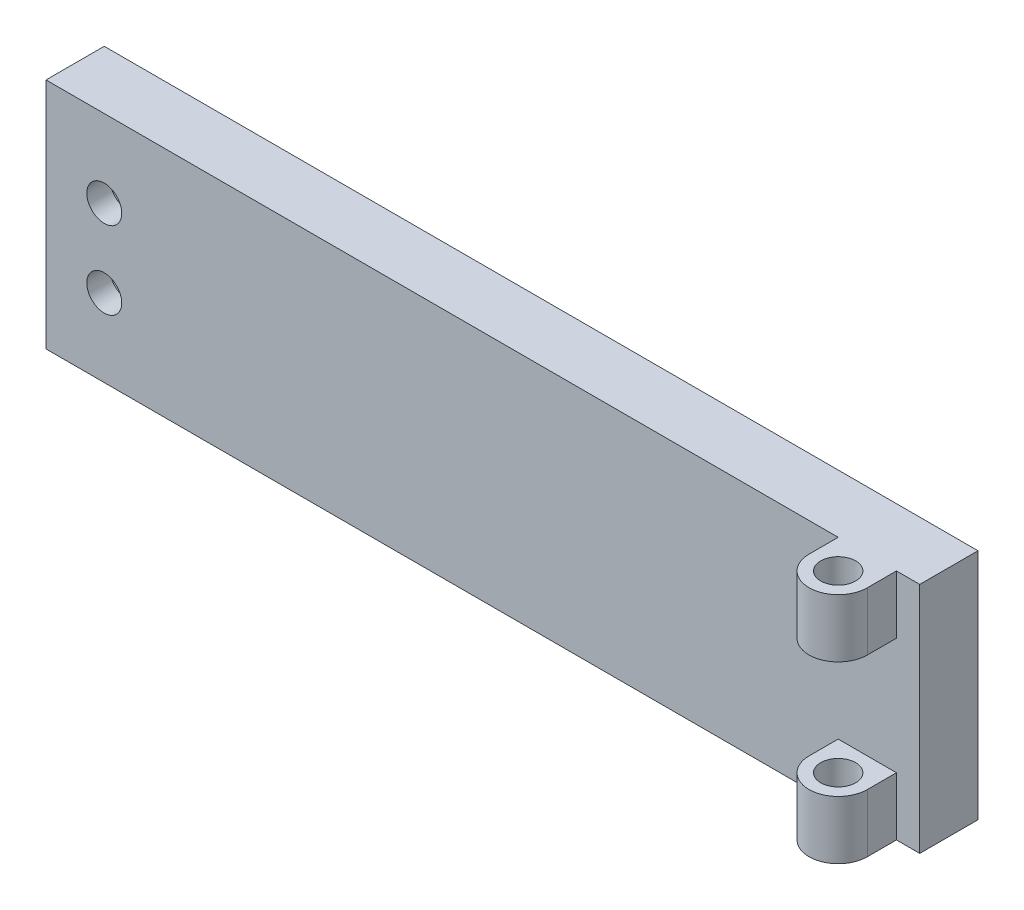
ISO-10303-21;
HEADER;
FILE_DESCRIPTION(('STEP AP214'),'2;1');
FILE_NAME('part.step','',(''),(''),'','','');
FILE_SCHEMA(('AUTOMOTIVE_DESIGN { 1 0 10303 214 1 1 1 1 }'));
ENDSEC;
DATA;
#1=APPLICATION_CONTEXT('core data for automotive mechanical design processes');
#2=APPLICATION_PROTOCOL_DEFINITION('international standard','automotive_design',2000,#1);
#3=PRODUCT_CONTEXT('',#1,'mechanical');
#4=PRODUCT('Part','Part','',(#3));
#5=PRODUCT_RELATED_PRODUCT_CATEGORY('part','',(#4));
#6=PRODUCT_DEFINITION_FORMATION('','',#4);
#7=PRODUCT_DEFINITION_CONTEXT('part definition',#1,'design');
#8=PRODUCT_DEFINITION('design','',#6,#7);
#9=PRODUCT_DEFINITION_SHAPE('','',#8);
#10=(LENGTH_UNIT() NAMED_UNIT(*) SI_UNIT(.MILLI.,.METRE.));
#11=(NAMED_UNIT(*) PLANE_ANGLE_UNIT() SI_UNIT($,.RADIAN.));
#12=(NAMED_UNIT(*) SI_UNIT($,.STERADIAN.) SOLID_ANGLE_UNIT());
#13=UNCERTAINTY_MEASURE_WITH_UNIT(LENGTH_MEASURE(1.E-05),#10,'distance_accuracy_value','');
#14=(GEOMETRIC_REPRESENTATION_CONTEXT(3) GLOBAL_UNCERTAINTY_ASSIGNED_CONTEXT((#13)) GLOBAL_UNIT_ASSIGNED_CONTEXT((#10,
#11,#12)) REPRESENTATION_CONTEXT('',''));
#15=CARTESIAN_POINT('',(0.,0.,0.));
#16=DIRECTION('',(0.,0.,1.));
#17=DIRECTION('',(1.,0.,0.));
#18=AXIS2_PLACEMENT_3D('',#15,#16,#17);
#19=CARTESIAN_POINT('',(5.,13.3333333333333,10.));
#20=DIRECTION('',(0.,0.,-1.));
#21=DIRECTION('',(-1.,0.,0.));
#22=AXIS2_PLACEMENT_3D('',#19,#20,#21);
#23=CYLINDRICAL_SURFACE('',#22,1.5);
#24=CARTESIAN_POINT('',(5.,13.3333333333333,5.));
#25=DIRECTION('',(0.,0.,-1.));
#26=DIRECTION('',(-1.,0.,0.));
#27=AXIS2_PLACEMENT_3D('',#24,#25,#26);
#28=CIRCLE('',#27,1.5);
#29=CARTESIAN_POINT('',(3.5,13.3333333333333,5.));
#30=VERTEX_POINT('',#29);
#31=EDGE_CURVE('E242',#30,#30,#28,.T.);
#32=ORIENTED_EDGE('',*,*,#31,.F.);
#33=EDGE_LOOP('',(#32));
#34=FACE_BOUND('',#33,.T.);
#35=CARTESIAN_POINT('',(5.,13.3333333333333,3.));
#36=DIRECTION('',(0.,0.,-1.));
#37=DIRECTION('',(-1.,0.,0.));
#38=AXIS2_PLACEMENT_3D('',#35,#36,#37);
#39=CIRCLE('',#38,1.5);
#40=CARTESIAN_POINT('',(3.5,13.3333333333333,3.));
#41=VERTEX_POINT('',#40);
#42=EDGE_CURVE('E80',#41,#41,#39,.F.);
#43=ORIENTED_EDGE('',*,*,#42,.F.);
#44=EDGE_LOOP('',(#43));
#45=FACE_BOUND('',#44,.T.);
#46=ADVANCED_FACE('F76',(#34,#45),#23,.F.);
#47=CARTESIAN_POINT('',(5.,6.66666666666667,10.));
#48=DIRECTION('',(0.,0.,-1.));
#49=DIRECTION('',(-1.,0.,0.));
#50=AXIS2_PLACEMENT_3D('',#47,#48,#49);
#51=CYLINDRICAL_SURFACE('',#50,1.5);
#52=CARTESIAN_POINT('',(5.,6.66666666666667,5.));
#53=DIRECTION('',(0.,0.,-1.));
#54=DIRECTION('',(-1.,0.,0.));
#55=AXIS2_PLACEMENT_3D('',#52,#53,#54);
#56=CIRCLE('',#55,1.5);
#57=CARTESIAN_POINT('',(3.5,6.66666666666667,5.));
#58=VERTEX_POINT('',#57);
#59=EDGE_CURVE('E259',#58,#58,#56,.T.);
#60=ORIENTED_EDGE('',*,*,#59,.F.);
#61=EDGE_LOOP('',(#60));
#62=FACE_BOUND('',#61,.T.);
#63=CARTESIAN_POINT('',(5.,6.66666666666667,3.));
#64=DIRECTION('',(0.,0.,-1.));
#65=DIRECTION('',(-1.,0.,0.));
#66=AXIS2_PLACEMENT_3D('',#63,#64,#65);
#67=CIRCLE('',#66,1.5);
#68=CARTESIAN_POINT('',(3.5,6.66666666666667,3.));
#69=VERTEX_POINT('',#68);
#70=EDGE_CURVE('E236',#69,#69,#67,.F.);
#71=ORIENTED_EDGE('',*,*,#70,.F.);
#72=EDGE_LOOP('',(#71));
#73=FACE_BOUND('',#72,.T.);
#74=ADVANCED_FACE('F319',(#62,#73),#51,.F.);
#75=CARTESIAN_POINT('',(0.,0.,5.));
#76=DIRECTION('',(0.,1.,0.));
#77=DIRECTION('',(0.,0.,1.));
#78=AXIS2_PLACEMENT_3D('',#75,#76,#77);
#79=PLANE('',#78);
#80=CARTESIAN_POINT('',(70.5,0.,7.5));
#81=DIRECTION('',(0.,-1.,0.));
#82=DIRECTION('',(0.,0.,-1.));
#83=AXIS2_PLACEMENT_3D('',#80,#81,#82);
#84=CIRCLE('',#83,1.5);
#85=CARTESIAN_POINT('',(70.5,0.,6.));
#86=VERTEX_POINT('',#85);
#87=EDGE_CURVE('E265',#86,#86,#84,.T.);
#88=ORIENTED_EDGE('',*,*,#87,.F.);
#89=EDGE_LOOP('',(#88));
#90=FACE_BOUND('',#89,.T.);
#91=DIRECTION('',(0.,0.,-1.));
#92=VECTOR('',#91,1.);
#93=CARTESIAN_POINT('',(73.,0.,10.));
#94=LINE('',#93,#92);
#95=CARTESIAN_POINT('',(73.,0.,7.5));
#96=VERTEX_POINT('',#95);
#97=CARTESIAN_POINT('',(73.,0.,5.));
#98=VERTEX_POINT('',#97);
#99=EDGE_CURVE('E285',#96,#98,#94,.T.);
#100=ORIENTED_EDGE('',*,*,#99,.F.);
#101=CARTESIAN_POINT('',(70.5,0.,7.5));
#102=DIRECTION('',(0.,-1.,0.));
#103=DIRECTION('',(0.,0.,-1.));
#104=AXIS2_PLACEMENT_3D('',#101,#102,#103);
#105=CIRCLE('',#104,2.5);
#106=CARTESIAN_POINT('',(68.,0.,7.5));
#107=VERTEX_POINT('',#106);
#108=EDGE_CURVE('E181',#107,#96,#105,.F.);
#109=ORIENTED_EDGE('',*,*,#108,.F.);
#110=DIRECTION('',(0.,0.,-1.));
#111=VECTOR('',#110,1.);
#112=CARTESIAN_POINT('',(68.,0.,10.));
#113=LINE('',#112,#111);
#114=CARTESIAN_POINT('',(68.,0.,5.));
#115=VERTEX_POINT('',#114);
#116=EDGE_CURVE('E287',#107,#115,#113,.T.);
#117=ORIENTED_EDGE('',*,*,#116,.T.);
#118=DIRECTION('',(1.,0.,0.));
#119=VECTOR('',#118,1.);
#120=CARTESIAN_POINT('',(0.,0.,5.));
#121=LINE('',#120,#119);
#122=CARTESIAN_POINT('',(0.,0.,5.));
#123=VERTEX_POINT('',#122);
#124=EDGE_CURVE('E210',#123,#115,#121,.T.);
#125=ORIENTED_EDGE('',*,*,#124,.F.);
#126=DIRECTION('',(0.,0.,-1.));
#127=VECTOR('',#126,1.);
#128=CARTESIAN_POINT('',(0.,0.,5.));
#129=LINE('',#128,#127);
#130=CARTESIAN_POINT('',(0.,0.,0.));
#131=VERTEX_POINT('',#130);
#132=EDGE_CURVE('E12',#123,#131,#129,.T.);
#133=ORIENTED_EDGE('',*,*,#132,.T.);
#134=DIRECTION('',(1.,0.,0.));
#135=VECTOR('',#134,1.);
#136=CARTESIAN_POINT('',(0.,0.,0.));
#137=LINE('',#136,#135);
#138=CARTESIAN_POINT('',(75.,0.,0.));
#139=VERTEX_POINT('',#138);
#140=EDGE_CURVE('E221',#131,#139,#137,.T.);
#141=ORIENTED_EDGE('',*,*,#140,.T.);
#142=DIRECTION('',(0.,0.,-1.));
#143=VECTOR('',#142,1.);
#144=CARTESIAN_POINT('',(75.,0.,5.));
#145=LINE('',#144,#143);
#146=CARTESIAN_POINT('',(75.,0.,5.));
#147=VERTEX_POINT('',#146);
#148=EDGE_CURVE('E85',#147,#139,#145,.T.);
#149=ORIENTED_EDGE('',*,*,#148,.F.);
#150=EDGE_CURVE('E208',#98,#147,#121,.T.);
#151=ORIENTED_EDGE('',*,*,#150,.F.);
#152=EDGE_LOOP('',(#100,#109,#117,#125,#133,#141,#149,#151));
#153=FACE_BOUND('',#152,.T.);
#154=ADVANCED_FACE('F325',(#90,#153),#79,.F.);
#155=CARTESIAN_POINT('',(0.,20.,5.));
#156=DIRECTION('',(0.,-1.,0.));
#157=DIRECTION('',(0.,0.,-1.));
#158=AXIS2_PLACEMENT_3D('',#155,#156,#157);
#159=PLANE('',#158);
#160=CARTESIAN_POINT('',(70.5,20.,7.5));
#161=DIRECTION('',(0.,-1.,0.));
#162=DIRECTION('',(0.,0.,-1.));
#163=AXIS2_PLACEMENT_3D('',#160,#161,#162);
#164=CIRCLE('',#163,1.5);
#165=CARTESIAN_POINT('',(70.5,20.,6.));
#166=VERTEX_POINT('',#165);
#167=EDGE_CURVE('E266',#166,#166,#164,.T.);
#168=ORIENTED_EDGE('',*,*,#167,.T.);
#169=EDGE_LOOP('',(#168));
#170=FACE_BOUND('',#169,.T.);
#171=CARTESIAN_POINT('',(70.5,20.,7.5));
#172=DIRECTION('',(0.,-1.,0.));
#173=DIRECTION('',(0.,0.,-1.));
#174=AXIS2_PLACEMENT_3D('',#171,#172,#173);
#175=CIRCLE('',#174,2.5);
#176=CARTESIAN_POINT('',(68.,20.,7.5));
#177=VERTEX_POINT('',#176);
#178=CARTESIAN_POINT('',(73.,20.,7.5));
#179=VERTEX_POINT('',#178);
#180=EDGE_CURVE('E169',#177,#179,#175,.F.);
#181=ORIENTED_EDGE('',*,*,#180,.T.);
#182=DIRECTION('',(0.,0.,-1.));
#183=VECTOR('',#182,1.);
#184=CARTESIAN_POINT('',(73.,20.,10.));
#185=LINE('',#184,#183);
#186=CARTESIAN_POINT('',(73.,20.,5.));
#187=VERTEX_POINT('',#186);
#188=EDGE_CURVE('E174',#179,#187,#185,.T.);
#189=ORIENTED_EDGE('',*,*,#188,.T.);
#190=DIRECTION('',(-1.,0.,0.));
#191=VECTOR('',#190,1.);
#192=CARTESIAN_POINT('',(0.,20.,5.));
#193=LINE('',#192,#191);
#194=CARTESIAN_POINT('',(75.,20.,5.));
#195=VERTEX_POINT('',#194);
#196=EDGE_CURVE('E216',#195,#187,#193,.T.);
#197=ORIENTED_EDGE('',*,*,#196,.F.);
#198=DIRECTION('',(0.,0.,-1.));
#199=VECTOR('',#198,1.);
#200=CARTESIAN_POINT('',(75.,20.,5.));
#201=LINE('',#200,#199);
#202=CARTESIAN_POINT('',(75.,20.,0.));
#203=VERTEX_POINT('',#202);
#204=EDGE_CURVE('E228',#195,#203,#201,.T.);
#205=ORIENTED_EDGE('',*,*,#204,.T.);
#206=DIRECTION('',(-1.,0.,0.));
#207=VECTOR('',#206,1.);
#208=CARTESIAN_POINT('',(0.,20.,0.));
#209=LINE('',#208,#207);
#210=CARTESIAN_POINT('',(0.,20.,0.));
#211=VERTEX_POINT('',#210);
#212=EDGE_CURVE('E209',#203,#211,#209,.T.);
#213=ORIENTED_EDGE('',*,*,#212,.T.);
#214=DIRECTION('',(0.,0.,-1.));
#215=VECTOR('',#214,1.);
#216=CARTESIAN_POINT('',(0.,20.,5.));
#217=LINE('',#216,#215);
#218=CARTESIAN_POINT('',(0.,20.,5.));
#219=VERTEX_POINT('',#218);
#220=EDGE_CURVE('E218',#219,#211,#217,.T.);
#221=ORIENTED_EDGE('',*,*,#220,.F.);
#222=CARTESIAN_POINT('',(68.,20.,5.));
#223=VERTEX_POINT('',#222);
#224=EDGE_CURVE('E215',#223,#219,#193,.T.);
#225=ORIENTED_EDGE('',*,*,#224,.F.);
#226=DIRECTION('',(0.,0.,-1.));
#227=VECTOR('',#226,1.);
#228=CARTESIAN_POINT('',(68.,20.,10.));
#229=LINE('',#228,#227);
#230=EDGE_CURVE('E177',#177,#223,#229,.T.);
#231=ORIENTED_EDGE('',*,*,#230,.F.);
#232=EDGE_LOOP('',(#181,#189,#197,#205,#213,#221,#225,#231));
#233=FACE_BOUND('',#232,.T.);
#234=ADVANCED_FACE('F171',(#170,#233),#159,.F.);
#235=CARTESIAN_POINT('',(68.,15.,10.));
#236=DIRECTION('',(0.,1.,0.));
#237=DIRECTION('',(0.,0.,1.));
#238=AXIS2_PLACEMENT_3D('',#235,#236,#237);
#239=PLANE('',#238);
#240=CARTESIAN_POINT('',(70.5,15.,7.5));
#241=DIRECTION('',(0.,1.,0.));
#242=DIRECTION('',(0.,0.,1.));
#243=AXIS2_PLACEMENT_3D('',#240,#241,#242);
#244=CIRCLE('',#243,1.5);
#245=CARTESIAN_POINT('',(70.5,15.,9.));
#246=VERTEX_POINT('',#245);
#247=EDGE_CURVE('E235',#246,#246,#244,.T.);
#248=ORIENTED_EDGE('',*,*,#247,.T.);
#249=EDGE_LOOP('',(#248));
#250=FACE_BOUND('',#249,.T.);
#251=DIRECTION('',(0.,0.,-1.));
#252=VECTOR('',#251,1.);
#253=CARTESIAN_POINT('',(73.,15.,10.));
#254=LINE('',#253,#252);
#255=CARTESIAN_POINT('',(73.,15.,7.5));
#256=VERTEX_POINT('',#255);
#257=CARTESIAN_POINT('',(73.,15.,5.));
#258=VERTEX_POINT('',#257);
#259=EDGE_CURVE('E196',#256,#258,#254,.T.);
#260=ORIENTED_EDGE('',*,*,#259,.F.);
#261=CARTESIAN_POINT('',(70.5,15.,7.5));
#262=DIRECTION('',(0.,1.,0.));
#263=DIRECTION('',(0.,0.,1.));
#264=AXIS2_PLACEMENT_3D('',#261,#262,#263);
#265=CIRCLE('',#264,2.5);
#266=CARTESIAN_POINT('',(68.,15.,7.5));
#267=VERTEX_POINT('',#266);
#268=EDGE_CURVE('E187',#256,#267,#265,.F.);
#269=ORIENTED_EDGE('',*,*,#268,.T.);
#270=DIRECTION('',(0.,0.,-1.));
#271=VECTOR('',#270,1.);
#272=CARTESIAN_POINT('',(68.,15.,10.));
#273=LINE('',#272,#271);
#274=CARTESIAN_POINT('',(68.,15.,5.));
#275=VERTEX_POINT('',#274);
#276=EDGE_CURVE('E198',#267,#275,#273,.T.);
#277=ORIENTED_EDGE('',*,*,#276,.T.);
#278=DIRECTION('',(1.,0.,0.));
#279=VECTOR('',#278,1.);
#280=CARTESIAN_POINT('',(68.,15.,5.));
#281=LINE('',#280,#279);
#282=EDGE_CURVE('E292',#275,#258,#281,.T.);
#283=ORIENTED_EDGE('',*,*,#282,.T.);
#284=EDGE_LOOP('',(#260,#269,#277,#283));
#285=FACE_BOUND('',#284,.T.);
#286=ADVANCED_FACE('F296',(#250,#285),#239,.F.);
#287=CARTESIAN_POINT('',(73.,20.,10.));
#288=DIRECTION('',(-1.,0.,0.));
#289=DIRECTION('',(0.,0.,1.));
#290=AXIS2_PLACEMENT_3D('',#287,#288,#289);
#291=PLANE('',#290);
#292=DIRECTION('',(0.,-1.,0.));
#293=VECTOR('',#292,1.);
#294=CARTESIAN_POINT('',(73.,20.,7.5));
#295=LINE('',#294,#293);
#296=EDGE_CURVE('E184',#179,#256,#295,.T.);
#297=ORIENTED_EDGE('',*,*,#296,.T.);
#298=ORIENTED_EDGE('',*,*,#259,.T.);
#299=DIRECTION('',(0.,1.,0.));
#300=VECTOR('',#299,1.);
#301=CARTESIAN_POINT('',(73.,20.,5.));
#302=LINE('',#301,#300);
#303=EDGE_CURVE('E195',#258,#187,#302,.T.);
#304=ORIENTED_EDGE('',*,*,#303,.T.);
#305=ORIENTED_EDGE('',*,*,#188,.F.);
#306=EDGE_LOOP('',(#297,#298,#304,#305));
#307=FACE_BOUND('',#306,.T.);
#308=ADVANCED_FACE('F193',(#307),#291,.F.);
#309=CARTESIAN_POINT('',(73.,0.,10.));
#310=DIRECTION('',(-1.,0.,0.));
#311=DIRECTION('',(0.,0.,1.));
#312=AXIS2_PLACEMENT_3D('',#309,#310,#311);
#313=PLANE('',#312);
#314=CARTESIAN_POINT('',(73.,5.,7.5));
#315=VERTEX_POINT('',#314);
#316=EDGE_CURVE('E190',#315,#96,#295,.T.);
#317=ORIENTED_EDGE('',*,*,#316,.T.);
#318=ORIENTED_EDGE('',*,*,#99,.T.);
#319=DIRECTION('',(0.,1.,0.));
#320=VECTOR('',#319,1.);
#321=CARTESIAN_POINT('',(73.,0.,5.));
#322=LINE('',#321,#320);
#323=CARTESIAN_POINT('',(73.,5.,5.));
#324=VERTEX_POINT('',#323);
#325=EDGE_CURVE('E278',#98,#324,#322,.T.);
#326=ORIENTED_EDGE('',*,*,#325,.T.);
#327=DIRECTION('',(0.,0.,-1.));
#328=VECTOR('',#327,1.);
#329=CARTESIAN_POINT('',(73.,5.,10.));
#330=LINE('',#329,#328);
#331=EDGE_CURVE('E101',#315,#324,#330,.T.);
#332=ORIENTED_EDGE('',*,*,#331,.F.);
#333=EDGE_LOOP('',(#317,#318,#326,#332));
#334=FACE_BOUND('',#333,.T.);
#335=ADVANCED_FACE('F343',(#334),#313,.F.);
#336=CARTESIAN_POINT('',(68.,5.,10.));
#337=DIRECTION('',(0.,-1.,0.));
#338=DIRECTION('',(0.,0.,-1.));
#339=AXIS2_PLACEMENT_3D('',#336,#337,#338);
#340=PLANE('',#339);
#341=CARTESIAN_POINT('',(70.5,5.,7.5));
#342=DIRECTION('',(0.,-1.,0.));
#343=DIRECTION('',(0.,0.,-1.));
#344=AXIS2_PLACEMENT_3D('',#341,#342,#343);
#345=CIRCLE('',#344,1.5);
#346=CARTESIAN_POINT('',(70.5,5.,6.));
#347=VERTEX_POINT('',#346);
#348=EDGE_CURVE('E233',#347,#347,#345,.T.);
#349=ORIENTED_EDGE('',*,*,#348,.T.);
#350=EDGE_LOOP('',(#349));
#351=FACE_BOUND('',#350,.T.);
#352=CARTESIAN_POINT('',(70.5,5.,7.5));
#353=DIRECTION('',(0.,-1.,0.));
#354=DIRECTION('',(0.,0.,-1.));
#355=AXIS2_PLACEMENT_3D('',#352,#353,#354);
#356=CIRCLE('',#355,2.5);
#357=CARTESIAN_POINT('',(68.,5.,7.5));
#358=VERTEX_POINT('',#357);
#359=EDGE_CURVE('E269',#358,#315,#356,.F.);
#360=ORIENTED_EDGE('',*,*,#359,.T.);
#361=ORIENTED_EDGE('',*,*,#331,.T.);
#362=DIRECTION('',(-1.,0.,0.));
#363=VECTOR('',#362,1.);
#364=CARTESIAN_POINT('',(68.,5.,5.));
#365=LINE('',#364,#363);
#366=CARTESIAN_POINT('',(68.,5.,5.));
#367=VERTEX_POINT('',#366);
#368=EDGE_CURVE('E281',#324,#367,#365,.T.);
#369=ORIENTED_EDGE('',*,*,#368,.T.);
#370=DIRECTION('',(0.,0.,-1.));
#371=VECTOR('',#370,1.);
#372=CARTESIAN_POINT('',(68.,5.,10.));
#373=LINE('',#372,#371);
#374=EDGE_CURVE('E93',#358,#367,#373,.T.);
#375=ORIENTED_EDGE('',*,*,#374,.F.);
#376=EDGE_LOOP('',(#360,#361,#369,#375));
#377=FACE_BOUND('',#376,.T.);
#378=ADVANCED_FACE('F340',(#351,#377),#340,.F.);
#379=CARTESIAN_POINT('',(0.,0.,5.));
#380=DIRECTION('',(0.,0.,-1.));
#381=DIRECTION('',(-1.,0.,0.));
#382=AXIS2_PLACEMENT_3D('',#379,#380,#381);
#383=PLANE('',#382);
#384=ORIENTED_EDGE('',*,*,#59,.T.);
#385=EDGE_LOOP('',(#384));
#386=FACE_BOUND('',#385,.T.);
#387=ORIENTED_EDGE('',*,*,#31,.T.);
#388=EDGE_LOOP('',(#387));
#389=FACE_BOUND('',#388,.T.);
#390=DIRECTION('',(0.,-1.,0.));
#391=VECTOR('',#390,1.);
#392=CARTESIAN_POINT('',(68.,0.,5.));
#393=LINE('',#392,#391);
#394=EDGE_CURVE('E276',#367,#115,#393,.T.);
#395=ORIENTED_EDGE('',*,*,#394,.F.);
#396=ORIENTED_EDGE('',*,*,#368,.F.);
#397=ORIENTED_EDGE('',*,*,#325,.F.);
#398=ORIENTED_EDGE('',*,*,#150,.T.);
#399=DIRECTION('',(0.,1.,0.));
#400=VECTOR('',#399,1.);
#401=CARTESIAN_POINT('',(75.,0.,5.));
#402=LINE('',#401,#400);
#403=EDGE_CURVE('E213',#147,#195,#402,.T.);
#404=ORIENTED_EDGE('',*,*,#403,.T.);
#405=ORIENTED_EDGE('',*,*,#196,.T.);
#406=ORIENTED_EDGE('',*,*,#303,.F.);
#407=ORIENTED_EDGE('',*,*,#282,.F.);
#408=DIRECTION('',(0.,-1.,0.));
#409=VECTOR('',#408,1.);
#410=CARTESIAN_POINT('',(68.,20.,5.));
#411=LINE('',#410,#409);
#412=EDGE_CURVE('E289',#223,#275,#411,.T.);
#413=ORIENTED_EDGE('',*,*,#412,.F.);
#414=ORIENTED_EDGE('',*,*,#224,.T.);
#415=DIRECTION('',(0.,-1.,0.));
#416=VECTOR('',#415,1.);
#417=CARTESIAN_POINT('',(0.,0.,5.));
#418=LINE('',#417,#416);
#419=EDGE_CURVE('E205',#219,#123,#418,.T.);
#420=ORIENTED_EDGE('',*,*,#419,.T.);
#421=ORIENTED_EDGE('',*,*,#124,.T.);
#422=EDGE_LOOP('',(#395,#396,#397,#398,#404,#405,#406,#407,#413,#414,#420,#421));
#423=FACE_BOUND('',#422,.T.);
#424=ADVANCED_FACE('F300',(#386,#389,#423),#383,.F.);
#425=CARTESIAN_POINT('',(0.,0.,5.));
#426=DIRECTION('',(1.,0.,0.));
#427=DIRECTION('',(0.,0.,-1.));
#428=AXIS2_PLACEMENT_3D('',#425,#426,#427);
#429=PLANE('',#428);
#430=DIRECTION('',(0.,-1.,0.));
#431=VECTOR('',#430,1.);
#432=CARTESIAN_POINT('',(0.,0.,0.));
#433=LINE('',#432,#431);
#434=EDGE_CURVE('E204',#211,#131,#433,.T.);
#435=ORIENTED_EDGE('',*,*,#434,.T.);
#436=ORIENTED_EDGE('',*,*,#132,.F.);
#437=ORIENTED_EDGE('',*,*,#419,.F.);
#438=ORIENTED_EDGE('',*,*,#220,.T.);
#439=EDGE_LOOP('',(#435,#436,#437,#438));
#440=FACE_BOUND('',#439,.T.);
#441=ADVANCED_FACE('F78',(#440),#429,.F.);
#442=CARTESIAN_POINT('',(75.,0.,5.));
#443=DIRECTION('',(-1.,0.,0.));
#444=DIRECTION('',(0.,0.,1.));
#445=AXIS2_PLACEMENT_3D('',#442,#443,#444);
#446=PLANE('',#445);
#447=DIRECTION('',(0.,1.,0.));
#448=VECTOR('',#447,1.);
#449=CARTESIAN_POINT('',(75.,0.,0.));
#450=LINE('',#449,#448);
#451=EDGE_CURVE('E223',#139,#203,#450,.T.);
#452=ORIENTED_EDGE('',*,*,#451,.T.);
#453=ORIENTED_EDGE('',*,*,#204,.F.);
#454=ORIENTED_EDGE('',*,*,#403,.F.);
#455=ORIENTED_EDGE('',*,*,#148,.T.);
#456=EDGE_LOOP('',(#452,#453,#454,#455));
#457=FACE_BOUND('',#456,.T.);
#458=ADVANCED_FACE('F313',(#457),#446,.F.);
#459=CARTESIAN_POINT('',(0.,0.,0.));
#460=DIRECTION('',(0.,0.,-1.));
#461=DIRECTION('',(-1.,0.,0.));
#462=AXIS2_PLACEMENT_3D('',#459,#460,#461);
#463=PLANE('',#462);
#464=CARTESIAN_POINT('',(5.,6.66666666666667,0.));
#465=DIRECTION('',(0.,0.,-1.));
#466=DIRECTION('',(-1.,0.,0.));
#467=AXIS2_PLACEMENT_3D('',#464,#465,#466);
#468=CIRCLE('',#467,3.);
#469=CARTESIAN_POINT('',(2.,6.66666666666667,0.));
#470=VERTEX_POINT('',#469);
#471=EDGE_CURVE('E244',#470,#470,#468,.T.);
#472=ORIENTED_EDGE('',*,*,#471,.F.);
#473=EDGE_LOOP('',(#472));
#474=FACE_BOUND('',#473,.T.);
#475=CARTESIAN_POINT('',(5.,13.3333333333333,0.));
#476=DIRECTION('',(0.,0.,-1.));
#477=DIRECTION('',(-1.,0.,0.));
#478=AXIS2_PLACEMENT_3D('',#475,#476,#477);
#479=CIRCLE('',#478,3.);
#480=CARTESIAN_POINT('',(2.,13.3333333333333,0.));
#481=VERTEX_POINT('',#480);
#482=EDGE_CURVE('E254',#481,#481,#479,.T.);
#483=ORIENTED_EDGE('',*,*,#482,.F.);
#484=EDGE_LOOP('',(#483));
#485=FACE_BOUND('',#484,.T.);
#486=ORIENTED_EDGE('',*,*,#434,.F.);
#487=ORIENTED_EDGE('',*,*,#212,.F.);
#488=ORIENTED_EDGE('',*,*,#451,.F.);
#489=ORIENTED_EDGE('',*,*,#140,.F.);
#490=EDGE_LOOP('',(#486,#487,#488,#489));
#491=FACE_BOUND('',#490,.T.);
#492=ADVANCED_FACE('F305',(#474,#485,#491),#463,.T.);
#493=CARTESIAN_POINT('',(68.,20.,10.));
#494=DIRECTION('',(1.,0.,0.));
#495=DIRECTION('',(0.,0.,-1.));
#496=AXIS2_PLACEMENT_3D('',#493,#494,#495);
#497=PLANE('',#496);
#498=ORIENTED_EDGE('',*,*,#276,.F.);
#499=DIRECTION('',(0.,-1.,0.));
#500=VECTOR('',#499,1.);
#501=CARTESIAN_POINT('',(68.,20.,7.5));
#502=LINE('',#501,#500);
#503=EDGE_CURVE('E263',#177,#267,#502,.T.);
#504=ORIENTED_EDGE('',*,*,#503,.F.);
#505=ORIENTED_EDGE('',*,*,#230,.T.);
#506=ORIENTED_EDGE('',*,*,#412,.T.);
#507=EDGE_LOOP('',(#498,#504,#505,#506));
#508=FACE_BOUND('',#507,.T.);
#509=ADVANCED_FACE('F302',(#508),#497,.F.);
#510=CARTESIAN_POINT('',(68.,0.,10.));
#511=DIRECTION('',(1.,0.,0.));
#512=DIRECTION('',(0.,0.,-1.));
#513=AXIS2_PLACEMENT_3D('',#510,#511,#512);
#514=PLANE('',#513);
#515=ORIENTED_EDGE('',*,*,#116,.F.);
#516=EDGE_CURVE('E180',#358,#107,#502,.T.);
#517=ORIENTED_EDGE('',*,*,#516,.F.);
#518=ORIENTED_EDGE('',*,*,#374,.T.);
#519=ORIENTED_EDGE('',*,*,#394,.T.);
#520=EDGE_LOOP('',(#515,#517,#518,#519));
#521=FACE_BOUND('',#520,.T.);
#522=ADVANCED_FACE('F304',(#521),#514,.F.);
#523=CARTESIAN_POINT('',(70.5,20.,7.5));
#524=DIRECTION('',(0.,-1.,0.));
#525=DIRECTION('',(0.,0.,-1.));
#526=AXIS2_PLACEMENT_3D('',#523,#524,#525);
#527=CYLINDRICAL_SURFACE('',#526,2.5);
#528=ORIENTED_EDGE('',*,*,#516,.T.);
#529=ORIENTED_EDGE('',*,*,#108,.T.);
#530=ORIENTED_EDGE('',*,*,#316,.F.);
#531=ORIENTED_EDGE('',*,*,#359,.F.);
#532=EDGE_LOOP('',(#528,#529,#530,#531));
#533=FACE_BOUND('',#532,.T.);
#534=ADVANCED_FACE('F311',(#533),#527,.T.);
#535=CARTESIAN_POINT('',(70.5,20.,7.5));
#536=DIRECTION('',(0.,-1.,0.));
#537=DIRECTION('',(0.,0.,-1.));
#538=AXIS2_PLACEMENT_3D('',#535,#536,#537);
#539=CYLINDRICAL_SURFACE('',#538,1.5);
#540=ORIENTED_EDGE('',*,*,#87,.T.);
#541=EDGE_LOOP('',(#540));
#542=FACE_BOUND('',#541,.T.);
#543=ORIENTED_EDGE('',*,*,#348,.F.);
#544=EDGE_LOOP('',(#543));
#545=FACE_BOUND('',#544,.T.);
#546=ADVANCED_FACE('F335',(#542,#545),#539,.F.);
#547=ORIENTED_EDGE('',*,*,#268,.F.);
#548=ORIENTED_EDGE('',*,*,#296,.F.);
#549=ORIENTED_EDGE('',*,*,#180,.F.);
#550=ORIENTED_EDGE('',*,*,#503,.T.);
#551=EDGE_LOOP('',(#547,#548,#549,#550));
#552=FACE_BOUND('',#551,.T.);
#553=ADVANCED_FACE('F185',(#552),#527,.T.);
#554=ORIENTED_EDGE('',*,*,#167,.F.);
#555=EDGE_LOOP('',(#554));
#556=FACE_BOUND('',#555,.T.);
#557=ORIENTED_EDGE('',*,*,#247,.F.);
#558=EDGE_LOOP('',(#557));
#559=FACE_BOUND('',#558,.T.);
#560=ADVANCED_FACE('F334',(#556,#559),#539,.F.);
#561=CARTESIAN_POINT('',(5.,6.66666666666667,3.));
#562=DIRECTION('',(0.,0.,-1.));
#563=DIRECTION('',(-1.,0.,0.));
#564=AXIS2_PLACEMENT_3D('',#561,#562,#563);
#565=PLANE('',#564);
#566=CARTESIAN_POINT('',(5.,6.66666666666667,3.));
#567=DIRECTION('',(0.,0.,-1.));
#568=DIRECTION('',(-1.,0.,0.));
#569=AXIS2_PLACEMENT_3D('',#566,#567,#568);
#570=CIRCLE('',#569,3.);
#571=CARTESIAN_POINT('',(2.,6.66666666666667,3.));
#572=VERTEX_POINT('',#571);
#573=EDGE_CURVE('E238',#572,#572,#570,.T.);
#574=ORIENTED_EDGE('',*,*,#573,.T.);
#575=EDGE_LOOP('',(#574));
#576=FACE_BOUND('',#575,.T.);
#577=ORIENTED_EDGE('',*,*,#70,.T.);
#578=EDGE_LOOP('',(#577));
#579=FACE_BOUND('',#578,.T.);
#580=ADVANCED_FACE('F338',(#576,#579),#565,.T.);
#581=CARTESIAN_POINT('',(5.,6.66666666666667,3.));
#582=DIRECTION('',(0.,0.,-1.));
#583=DIRECTION('',(-1.,0.,0.));
#584=AXIS2_PLACEMENT_3D('',#581,#582,#583);
#585=CYLINDRICAL_SURFACE('',#584,3.);
#586=ORIENTED_EDGE('',*,*,#573,.F.);
#587=EDGE_LOOP('',(#586));
#588=FACE_BOUND('',#587,.T.);
#589=ORIENTED_EDGE('',*,*,#471,.T.);
#590=EDGE_LOOP('',(#589));
#591=FACE_BOUND('',#590,.T.);
#592=ADVANCED_FACE('F413',(#588,#591),#585,.F.);
#593=CARTESIAN_POINT('',(5.,13.3333333333333,3.));
#594=DIRECTION('',(0.,0.,-1.));
#595=DIRECTION('',(-1.,0.,0.));
#596=AXIS2_PLACEMENT_3D('',#593,#594,#595);
#597=PLANE('',#596);
#598=CARTESIAN_POINT('',(5.,13.3333333333333,3.));
#599=DIRECTION('',(0.,0.,-1.));
#600=DIRECTION('',(-1.,0.,0.));
#601=AXIS2_PLACEMENT_3D('',#598,#599,#600);
#602=CIRCLE('',#601,3.);
#603=CARTESIAN_POINT('',(2.,13.3333333333333,3.));
#604=VERTEX_POINT('',#603);
#605=EDGE_CURVE('E249',#604,#604,#602,.T.);
#606=ORIENTED_EDGE('',*,*,#605,.T.);
#607=EDGE_LOOP('',(#606));
#608=FACE_BOUND('',#607,.T.);
#609=ORIENTED_EDGE('',*,*,#42,.T.);
#610=EDGE_LOOP('',(#609));
#611=FACE_BOUND('',#610,.T.);
#612=ADVANCED_FACE('F421',(#608,#611),#597,.T.);
#613=CARTESIAN_POINT('',(5.,13.3333333333333,3.));
#614=DIRECTION('',(0.,0.,-1.));
#615=DIRECTION('',(-1.,0.,0.));
#616=AXIS2_PLACEMENT_3D('',#613,#614,#615);
#617=CYLINDRICAL_SURFACE('',#616,3.);
#618=ORIENTED_EDGE('',*,*,#605,.F.);
#619=EDGE_LOOP('',(#618));
#620=FACE_BOUND('',#619,.T.);
#621=ORIENTED_EDGE('',*,*,#482,.T.);
#622=EDGE_LOOP('',(#621));
#623=FACE_BOUND('',#622,.T.);
#624=ADVANCED_FACE('F429',(#620,#623),#617,.F.);
#625=CLOSED_SHELL('',(#46,#74,#154,#234,#286,#308,#335,#378,#424,#441,#458,#492,#509,#522,#534,
#546,#553,#560,#580,#592,#612,#624));
#626=MANIFOLD_SOLID_BREP('B2',#625);
#627=ADVANCED_BREP_SHAPE_REPRESENTATION('',(#18,#626),#14);
#628=SHAPE_DEFINITION_REPRESENTATION(#9,#627);
ENDSEC;
END-ISO-10303-21;
